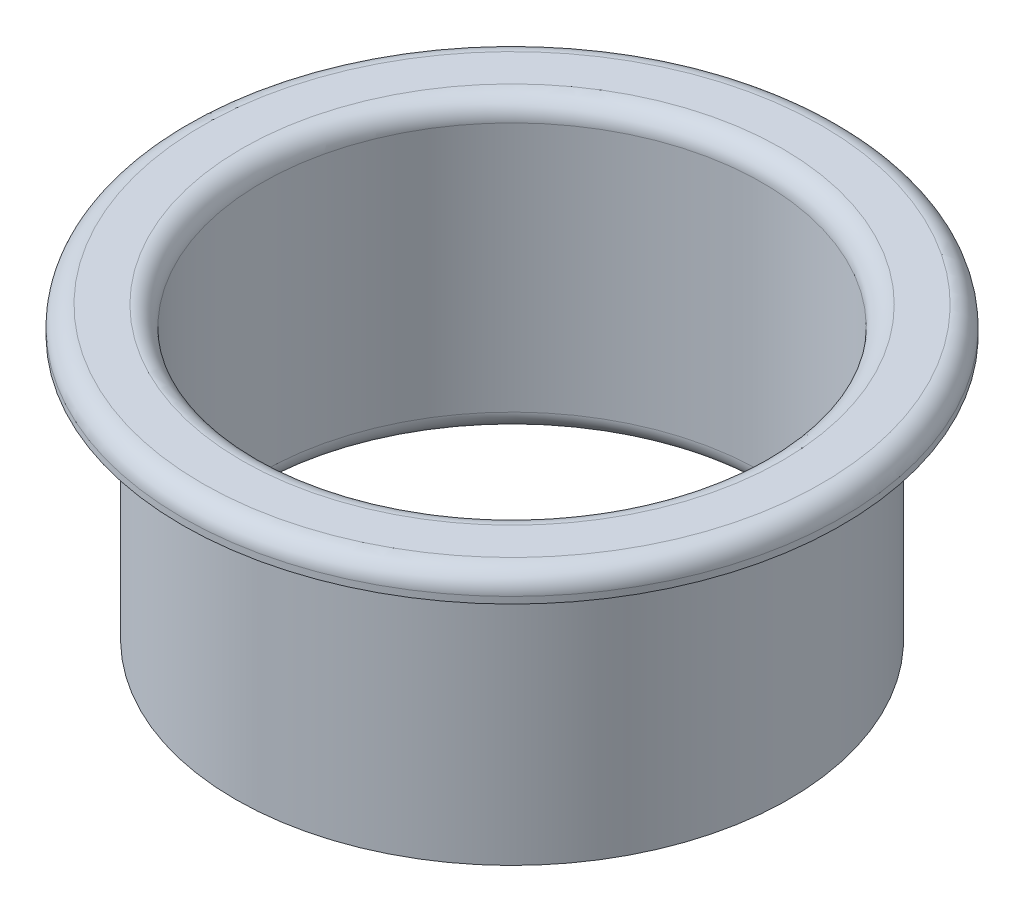
ISO-10303-21;
HEADER;
FILE_DESCRIPTION(('STEP AP214'),'2;1');
FILE_NAME('part.step','',(''),(''),'','','');
FILE_SCHEMA(('AUTOMOTIVE_DESIGN { 1 0 10303 214 1 1 1 1 }'));
ENDSEC;
DATA;
#1=APPLICATION_CONTEXT('core data for automotive mechanical design processes');
#2=APPLICATION_PROTOCOL_DEFINITION('international standard','automotive_design',2000,#1);
#3=PRODUCT_CONTEXT('',#1,'mechanical');
#4=PRODUCT('Part','Part','',(#3));
#5=PRODUCT_RELATED_PRODUCT_CATEGORY('part','',(#4));
#6=PRODUCT_DEFINITION_FORMATION('','',#4);
#7=PRODUCT_DEFINITION_CONTEXT('part definition',#1,'design');
#8=PRODUCT_DEFINITION('design','',#6,#7);
#9=PRODUCT_DEFINITION_SHAPE('','',#8);
#10=(LENGTH_UNIT() NAMED_UNIT(*) SI_UNIT(.MILLI.,.METRE.));
#11=(NAMED_UNIT(*) PLANE_ANGLE_UNIT() SI_UNIT($,.RADIAN.));
#12=(NAMED_UNIT(*) SI_UNIT($,.STERADIAN.) SOLID_ANGLE_UNIT());
#13=UNCERTAINTY_MEASURE_WITH_UNIT(LENGTH_MEASURE(1.E-05),#10,'distance_accuracy_value','');
#14=(GEOMETRIC_REPRESENTATION_CONTEXT(3) GLOBAL_UNCERTAINTY_ASSIGNED_CONTEXT((#13)) GLOBAL_UNIT_ASSIGNED_CONTEXT((#10,
#11,#12)) REPRESENTATION_CONTEXT('',''));
#15=CARTESIAN_POINT('',(0.,0.,0.));
#16=DIRECTION('',(0.,0.,1.));
#17=DIRECTION('',(1.,0.,0.));
#18=AXIS2_PLACEMENT_3D('',#15,#16,#17);
#19=CARTESIAN_POINT('',(0.,-10.,0.));
#20=DIRECTION('',(0.,1.,0.));
#21=DIRECTION('',(0.,0.,1.));
#22=AXIS2_PLACEMENT_3D('',#19,#20,#21);
#23=CYLINDRICAL_SURFACE('',#22,10.5);
#24=CARTESIAN_POINT('',(0.,-0.750000000000001,0.));
#25=DIRECTION('',(0.,1.,0.));
#26=DIRECTION('',(0.,0.,1.));
#27=AXIS2_PLACEMENT_3D('',#24,#25,#26);
#28=CIRCLE('',#27,10.5);
#29=CARTESIAN_POINT('',(0.,-0.750000000000001,10.5));
#30=VERTEX_POINT('',#29);
#31=EDGE_CURVE('E46',#30,#30,#28,.F.);
#32=ORIENTED_EDGE('',*,*,#31,.T.);
#33=EDGE_LOOP('',(#32));
#34=FACE_BOUND('',#33,.T.);
#35=CARTESIAN_POINT('',(0.,-10.,0.));
#36=DIRECTION('',(0.,1.,0.));
#37=DIRECTION('',(0.,0.,1.));
#38=AXIS2_PLACEMENT_3D('',#35,#36,#37);
#39=CIRCLE('',#38,10.5);
#40=CARTESIAN_POINT('',(0.,-10.,10.5));
#41=VERTEX_POINT('',#40);
#42=EDGE_CURVE('E63',#41,#41,#39,.T.);
#43=ORIENTED_EDGE('',*,*,#42,.T.);
#44=EDGE_LOOP('',(#43));
#45=FACE_BOUND('',#44,.T.);
#46=ADVANCED_FACE('F31',(#34,#45),#23,.T.);
#47=CARTESIAN_POINT('',(0.,-10.,0.));
#48=DIRECTION('',(0.,1.,0.));
#49=DIRECTION('',(0.,0.,1.));
#50=AXIS2_PLACEMENT_3D('',#47,#48,#49);
#51=PLANE('',#50);
#52=CARTESIAN_POINT('',(0.,-10.,0.));
#53=DIRECTION('',(0.,1.,0.));
#54=DIRECTION('',(0.,0.,1.));
#55=AXIS2_PLACEMENT_3D('',#52,#53,#54);
#56=CIRCLE('',#55,10.25);
#57=CARTESIAN_POINT('',(0.,-10.,10.25));
#58=VERTEX_POINT('',#57);
#59=EDGE_CURVE('E60',#58,#58,#56,.T.);
#60=ORIENTED_EDGE('',*,*,#59,.T.);
#61=EDGE_LOOP('',(#60));
#62=FACE_BOUND('',#61,.T.);
#63=ORIENTED_EDGE('',*,*,#42,.F.);
#64=EDGE_LOOP('',(#63));
#65=FACE_BOUND('',#64,.T.);
#66=ADVANCED_FACE('F86',(#62,#65),#51,.F.);
#67=CARTESIAN_POINT('',(0.,-10.,0.));
#68=DIRECTION('',(0.,1.,0.));
#69=DIRECTION('',(0.,0.,1.));
#70=AXIS2_PLACEMENT_3D('',#67,#68,#69);
#71=CYLINDRICAL_SURFACE('',#70,9.5);
#72=CARTESIAN_POINT('',(0.,-9.25,0.));
#73=DIRECTION('',(0.,1.,0.));
#74=DIRECTION('',(0.,0.,1.));
#75=AXIS2_PLACEMENT_3D('',#72,#73,#74);
#76=CIRCLE('',#75,9.5);
#77=CARTESIAN_POINT('',(0.,-9.25,9.5));
#78=VERTEX_POINT('',#77);
#79=EDGE_CURVE('E54',#78,#78,#76,.F.);
#80=ORIENTED_EDGE('',*,*,#79,.T.);
#81=EDGE_LOOP('',(#80));
#82=FACE_BOUND('',#81,.T.);
#83=CARTESIAN_POINT('',(0.,0.25,0.));
#84=DIRECTION('',(0.,1.,0.));
#85=DIRECTION('',(0.,0.,1.));
#86=AXIS2_PLACEMENT_3D('',#83,#84,#85);
#87=CIRCLE('',#86,9.5);
#88=CARTESIAN_POINT('',(0.,0.25,9.5));
#89=VERTEX_POINT('',#88);
#90=EDGE_CURVE('E57',#89,#89,#87,.T.);
#91=ORIENTED_EDGE('',*,*,#90,.T.);
#92=EDGE_LOOP('',(#91));
#93=FACE_BOUND('',#92,.T.);
#94=ADVANCED_FACE('F83',(#82,#93),#71,.F.);
#95=CARTESIAN_POINT('',(0.,1.,0.));
#96=DIRECTION('',(0.,1.,0.));
#97=DIRECTION('',(0.,0.,1.));
#98=AXIS2_PLACEMENT_3D('',#95,#96,#97);
#99=PLANE('',#98);
#100=CARTESIAN_POINT('',(0.,1.,0.));
#101=DIRECTION('',(0.,1.,0.));
#102=DIRECTION('',(0.,0.,1.));
#103=AXIS2_PLACEMENT_3D('',#100,#101,#102);
#104=CIRCLE('',#103,11.75);
#105=CARTESIAN_POINT('',(0.,1.,11.75));
#106=VERTEX_POINT('',#105);
#107=EDGE_CURVE('E38',#106,#106,#104,.T.);
#108=ORIENTED_EDGE('',*,*,#107,.T.);
#109=EDGE_LOOP('',(#108));
#110=FACE_BOUND('',#109,.T.);
#111=CARTESIAN_POINT('',(0.,1.,0.));
#112=DIRECTION('',(0.,1.,0.));
#113=DIRECTION('',(0.,0.,1.));
#114=AXIS2_PLACEMENT_3D('',#111,#112,#113);
#115=CIRCLE('',#114,10.25);
#116=CARTESIAN_POINT('',(0.,1.,10.25));
#117=VERTEX_POINT('',#116);
#118=EDGE_CURVE('E42',#117,#117,#115,.F.);
#119=ORIENTED_EDGE('',*,*,#118,.T.);
#120=EDGE_LOOP('',(#119));
#121=FACE_BOUND('',#120,.T.);
#122=ADVANCED_FACE('F74',(#110,#121),#99,.T.);
#123=CARTESIAN_POINT('',(0.,0.,0.));
#124=DIRECTION('',(0.,1.,0.));
#125=DIRECTION('',(0.,0.,1.));
#126=AXIS2_PLACEMENT_3D('',#123,#124,#125);
#127=PLANE('',#126);
#128=CARTESIAN_POINT('',(0.,0.,0.));
#129=DIRECTION('',(0.,1.,0.));
#130=DIRECTION('',(0.,0.,1.));
#131=AXIS2_PLACEMENT_3D('',#128,#129,#130);
#132=CIRCLE('',#131,11.25);
#133=CARTESIAN_POINT('',(0.,0.,11.25));
#134=VERTEX_POINT('',#133);
#135=EDGE_CURVE('E51',#134,#134,#132,.T.);
#136=ORIENTED_EDGE('',*,*,#135,.T.);
#137=EDGE_LOOP('',(#136));
#138=FACE_BOUND('',#137,.T.);
#139=CARTESIAN_POINT('',(0.,0.,0.));
#140=DIRECTION('',(0.,1.,0.));
#141=DIRECTION('',(0.,0.,1.));
#142=AXIS2_PLACEMENT_3D('',#139,#140,#141);
#143=CIRCLE('',#142,12.5);
#144=CARTESIAN_POINT('',(0.,0.,12.5));
#145=VERTEX_POINT('',#144);
#146=EDGE_CURVE('E66',#145,#145,#143,.T.);
#147=ORIENTED_EDGE('',*,*,#146,.F.);
#148=EDGE_LOOP('',(#147));
#149=FACE_BOUND('',#148,.T.);
#150=ADVANCED_FACE('F72',(#138,#149),#127,.F.);
#151=CARTESIAN_POINT('',(0.,1.,0.));
#152=DIRECTION('',(0.,-1.,0.));
#153=DIRECTION('',(0.,0.,-1.));
#154=AXIS2_PLACEMENT_3D('',#151,#152,#153);
#155=CYLINDRICAL_SURFACE('',#154,12.5);
#156=CARTESIAN_POINT('',(0.,0.25,0.));
#157=DIRECTION('',(0.,1.,0.));
#158=DIRECTION('',(0.,0.,1.));
#159=AXIS2_PLACEMENT_3D('',#156,#157,#158);
#160=CIRCLE('',#159,12.5);
#161=CARTESIAN_POINT('',(0.,0.25,12.5));
#162=VERTEX_POINT('',#161);
#163=EDGE_CURVE('E10',#162,#162,#160,.F.);
#164=ORIENTED_EDGE('',*,*,#163,.T.);
#165=EDGE_LOOP('',(#164));
#166=FACE_BOUND('',#165,.T.);
#167=ORIENTED_EDGE('',*,*,#146,.T.);
#168=EDGE_LOOP('',(#167));
#169=FACE_BOUND('',#168,.T.);
#170=ADVANCED_FACE('F70',(#166,#169),#155,.T.);
#171=CARTESIAN_POINT('',(0.,-9.25,0.));
#172=DIRECTION('',(0.,1.,0.));
#173=DIRECTION('',(0.,0.,1.));
#174=AXIS2_PLACEMENT_3D('',#171,#172,#173);
#175=TOROIDAL_SURFACE('',#174,10.25,0.75);
#176=ORIENTED_EDGE('',*,*,#79,.F.);
#177=EDGE_LOOP('',(#176));
#178=FACE_BOUND('',#177,.T.);
#179=ORIENTED_EDGE('',*,*,#59,.F.);
#180=EDGE_LOOP('',(#179));
#181=FACE_BOUND('',#180,.T.);
#182=ADVANCED_FACE('F81',(#178,#181),#175,.T.);
#183=CARTESIAN_POINT('',(0.,-0.750000000000001,0.));
#184=DIRECTION('',(0.,1.,0.));
#185=DIRECTION('',(0.,0.,1.));
#186=AXIS2_PLACEMENT_3D('',#183,#184,#185);
#187=TOROIDAL_SURFACE('',#186,11.25,0.75);
#188=ORIENTED_EDGE('',*,*,#31,.F.);
#189=EDGE_LOOP('',(#188));
#190=FACE_BOUND('',#189,.T.);
#191=ORIENTED_EDGE('',*,*,#135,.F.);
#192=EDGE_LOOP('',(#191));
#193=FACE_BOUND('',#192,.T.);
#194=ADVANCED_FACE('F99',(#190,#193),#187,.F.);
#195=CARTESIAN_POINT('',(0.,0.25,0.));
#196=DIRECTION('',(0.,1.,0.));
#197=DIRECTION('',(0.,0.,1.));
#198=AXIS2_PLACEMENT_3D('',#195,#196,#197);
#199=TOROIDAL_SURFACE('',#198,11.75,0.75);
#200=ORIENTED_EDGE('',*,*,#163,.F.);
#201=EDGE_LOOP('',(#200));
#202=FACE_BOUND('',#201,.T.);
#203=ORIENTED_EDGE('',*,*,#107,.F.);
#204=EDGE_LOOP('',(#203));
#205=FACE_BOUND('',#204,.T.);
#206=ADVANCED_FACE('F102',(#202,#205),#199,.T.);
#207=CARTESIAN_POINT('',(0.,0.25,0.));
#208=DIRECTION('',(0.,1.,0.));
#209=DIRECTION('',(0.,0.,1.));
#210=AXIS2_PLACEMENT_3D('',#207,#208,#209);
#211=TOROIDAL_SURFACE('',#210,10.25,0.75);
#212=ORIENTED_EDGE('',*,*,#118,.F.);
#213=EDGE_LOOP('',(#212));
#214=FACE_BOUND('',#213,.T.);
#215=ORIENTED_EDGE('',*,*,#90,.F.);
#216=EDGE_LOOP('',(#215));
#217=FACE_BOUND('',#216,.T.);
#218=ADVANCED_FACE('F33',(#214,#217),#211,.T.);
#219=CLOSED_SHELL('',(#46,#66,#94,#122,#150,#170,#182,#194,#206,#218));
#220=MANIFOLD_SOLID_BREP('B2',#219);
#221=ADVANCED_BREP_SHAPE_REPRESENTATION('',(#18,#220),#14);
#222=SHAPE_DEFINITION_REPRESENTATION(#9,#221);
ENDSEC;
END-ISO-10303-21;
